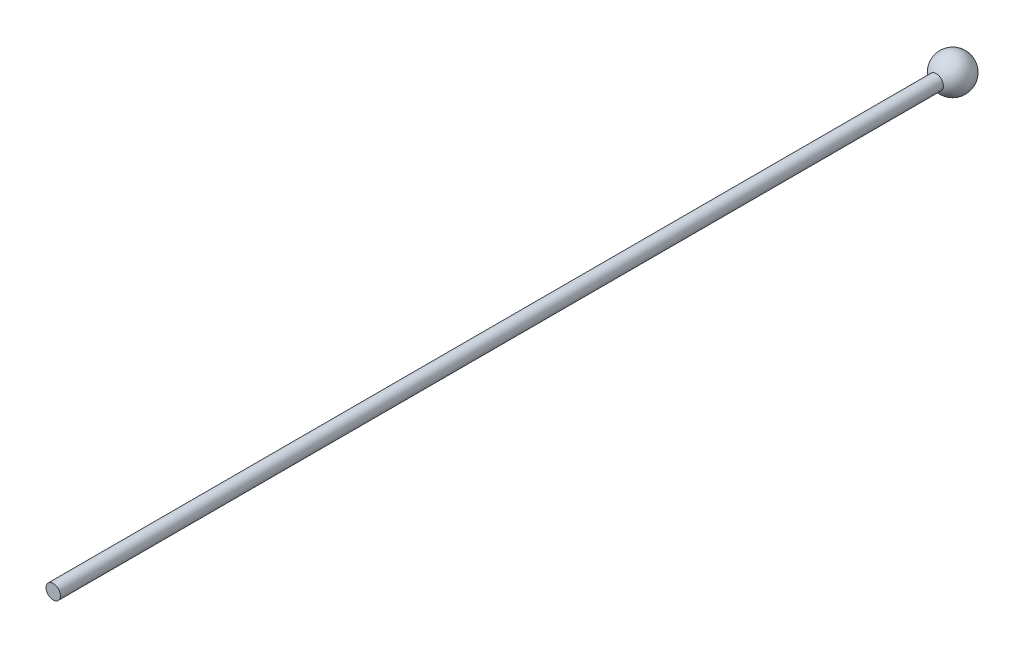
ISO-10303-21;
HEADER;
FILE_DESCRIPTION(('STEP AP214'),'2;1');
FILE_NAME('part.step','',(''),(''),'','','');
FILE_SCHEMA(('AUTOMOTIVE_DESIGN { 1 0 10303 214 1 1 1 1 }'));
ENDSEC;
DATA;
#1=APPLICATION_CONTEXT('core data for automotive mechanical design processes');
#2=APPLICATION_PROTOCOL_DEFINITION('international standard','automotive_design',2000,#1);
#3=PRODUCT_CONTEXT('',#1,'mechanical');
#4=PRODUCT('Part','Part','',(#3));
#5=PRODUCT_RELATED_PRODUCT_CATEGORY('part','',(#4));
#6=PRODUCT_DEFINITION_FORMATION('','',#4);
#7=PRODUCT_DEFINITION_CONTEXT('part definition',#1,'design');
#8=PRODUCT_DEFINITION('design','',#6,#7);
#9=PRODUCT_DEFINITION_SHAPE('','',#8);
#10=(LENGTH_UNIT() NAMED_UNIT(*) SI_UNIT(.MILLI.,.METRE.));
#11=(NAMED_UNIT(*) PLANE_ANGLE_UNIT() SI_UNIT($,.RADIAN.));
#12=(NAMED_UNIT(*) SI_UNIT($,.STERADIAN.) SOLID_ANGLE_UNIT());
#13=UNCERTAINTY_MEASURE_WITH_UNIT(LENGTH_MEASURE(1.E-05),#10,'distance_accuracy_value','');
#14=(GEOMETRIC_REPRESENTATION_CONTEXT(3) GLOBAL_UNCERTAINTY_ASSIGNED_CONTEXT((#13)) GLOBAL_UNIT_ASSIGNED_CONTEXT((#10,
#11,#12)) REPRESENTATION_CONTEXT('',''));
#15=CARTESIAN_POINT('',(0.,0.,0.));
#16=DIRECTION('',(0.,0.,1.));
#17=DIRECTION('',(1.,0.,0.));
#18=AXIS2_PLACEMENT_3D('',#15,#16,#17);
#19=CARTESIAN_POINT('',(0.,0.,0.));
#20=DIRECTION('',(-1.,0.,0.));
#21=DIRECTION('',(0.,1.,0.));
#22=AXIS2_PLACEMENT_3D('',#19,#20,#21);
#23=SPHERICAL_SURFACE('',#22,10.);
#24=CARTESIAN_POINT('',(0.,0.,0.));
#25=DIRECTION('',(0.,0.,-1.));
#26=DIRECTION('',(-1.,0.,0.));
#27=AXIS2_PLACEMENT_3D('',#24,#25,#26);
#28=SPHERICAL_SURFACE('',#27,10.);
#29=CARTESIAN_POINT('',(0.,0.,9.16515138991168));
#30=DIRECTION('',(0.,0.,-1.));
#31=DIRECTION('',(-1.,0.,0.));
#32=AXIS2_PLACEMENT_3D('',#29,#30,#31);
#33=CIRCLE('',#32,4.);
#34=CARTESIAN_POINT('',(-4.,0.,9.16515138991168));
#35=VERTEX_POINT('',#34);
#36=EDGE_CURVE('E10',#35,#35,#33,.F.);
#37=ORIENTED_EDGE('',*,*,#36,.F.);
#38=EDGE_LOOP('',(#37));
#39=FACE_BOUND('',#38,.T.);
#40=ADVANCED_FACE('F46',(#39),#28,.T.);
#41=CARTESIAN_POINT('',(0.,0.,500.));
#42=DIRECTION('',(0.,0.,-1.));
#43=DIRECTION('',(-1.,0.,0.));
#44=AXIS2_PLACEMENT_3D('',#41,#42,#43);
#45=CYLINDRICAL_SURFACE('',#44,4.);
#46=CARTESIAN_POINT('',(0.,0.,500.));
#47=DIRECTION('',(0.,0.,1.));
#48=DIRECTION('',(1.,0.,0.));
#49=AXIS2_PLACEMENT_3D('',#46,#47,#48);
#50=CIRCLE('',#49,4.);
#51=CARTESIAN_POINT('',(4.,0.,500.));
#52=VERTEX_POINT('',#51);
#53=EDGE_CURVE('E56',#52,#52,#50,.T.);
#54=ORIENTED_EDGE('',*,*,#53,.F.);
#55=EDGE_LOOP('',(#54));
#56=FACE_BOUND('',#55,.T.);
#57=ORIENTED_EDGE('',*,*,#36,.T.);
#58=EDGE_LOOP('',(#57));
#59=FACE_BOUND('',#58,.T.);
#60=ADVANCED_FACE('F72',(#56,#59),#45,.T.);
#61=CARTESIAN_POINT('',(0.,0.,500.));
#62=DIRECTION('',(0.,0.,1.));
#63=DIRECTION('',(1.,0.,0.));
#64=AXIS2_PLACEMENT_3D('',#61,#62,#63);
#65=PLANE('',#64);
#66=ORIENTED_EDGE('',*,*,#53,.T.);
#67=EDGE_LOOP('',(#66));
#68=FACE_BOUND('',#67,.T.);
#69=ADVANCED_FACE('F67',(#68),#65,.T.);
#70=CLOSED_SHELL('',(#40,#60,#69));
#71=CARTESIAN_POINT('',(0.,0.,0.));
#72=DIRECTION('',(-1.,0.,0.));
#73=DIRECTION('',(0.,1.,0.));
#74=AXIS2_PLACEMENT_3D('',#71,#72,#73);
#75=SPHERICAL_SURFACE('',#74,8.);
#76=CARTESIAN_POINT('',(0.,0.,0.));
#77=DIRECTION('',(0.,0.,-1.));
#78=DIRECTION('',(-1.,0.,0.));
#79=AXIS2_PLACEMENT_3D('',#76,#77,#78);
#80=SPHERICAL_SURFACE('',#79,8.);
#81=CARTESIAN_POINT('',(0.,0.,6.92820323027551));
#82=DIRECTION('',(0.,0.,-1.));
#83=DIRECTION('',(-1.,0.,0.));
#84=AXIS2_PLACEMENT_3D('',#81,#82,#83);
#85=CIRCLE('',#84,4.);
#86=CARTESIAN_POINT('',(-4.,0.,6.92820323027551));
#87=VERTEX_POINT('',#86);
#88=EDGE_CURVE('E47',#87,#87,#85,.F.);
#89=ORIENTED_EDGE('',*,*,#88,.T.);
#90=EDGE_LOOP('',(#89));
#91=FACE_BOUND('',#90,.T.);
#92=ADVANCED_FACE('F90',(#91),#80,.F.);
#93=CARTESIAN_POINT('',(0.,0.,0.));
#94=DIRECTION('',(0.,0.,1.));
#95=DIRECTION('',(1.,0.,0.));
#96=AXIS2_PLACEMENT_3D('',#93,#94,#95);
#97=PLANE('',#96);
#98=CARTESIAN_POINT('',(0.,0.,0.));
#99=DIRECTION('',(0.,0.,1.));
#100=DIRECTION('',(1.,0.,0.));
#101=AXIS2_PLACEMENT_3D('',#98,#99,#100);
#102=CIRCLE('',#101,4.);
#103=CARTESIAN_POINT('',(4.,0.,0.));
#104=VERTEX_POINT('',#103);
#105=EDGE_CURVE('E64',#104,#104,#102,.T.);
#106=ORIENTED_EDGE('',*,*,#105,.F.);
#107=EDGE_LOOP('',(#106));
#108=FACE_BOUND('',#107,.T.);
#109=ADVANCED_FACE('F81',(#108),#97,.F.);
#110=ORIENTED_EDGE('',*,*,#88,.F.);
#111=EDGE_LOOP('',(#110));
#112=FACE_BOUND('',#111,.T.);
#113=ORIENTED_EDGE('',*,*,#105,.T.);
#114=EDGE_LOOP('',(#113));
#115=FACE_BOUND('',#114,.T.);
#116=ADVANCED_FACE('F74',(#112,#115),#45,.T.);
#117=CLOSED_SHELL('',(#92,#109,#116));
#118=ORIENTED_CLOSED_SHELL('',*,#117,.T.);
#119=BREP_WITH_VOIDS('B2',#70,(#118));
#120=ADVANCED_BREP_SHAPE_REPRESENTATION('',(#18,#119),#14);
#121=SHAPE_DEFINITION_REPRESENTATION(#9,#120);
ENDSEC;
END-ISO-10303-21;
